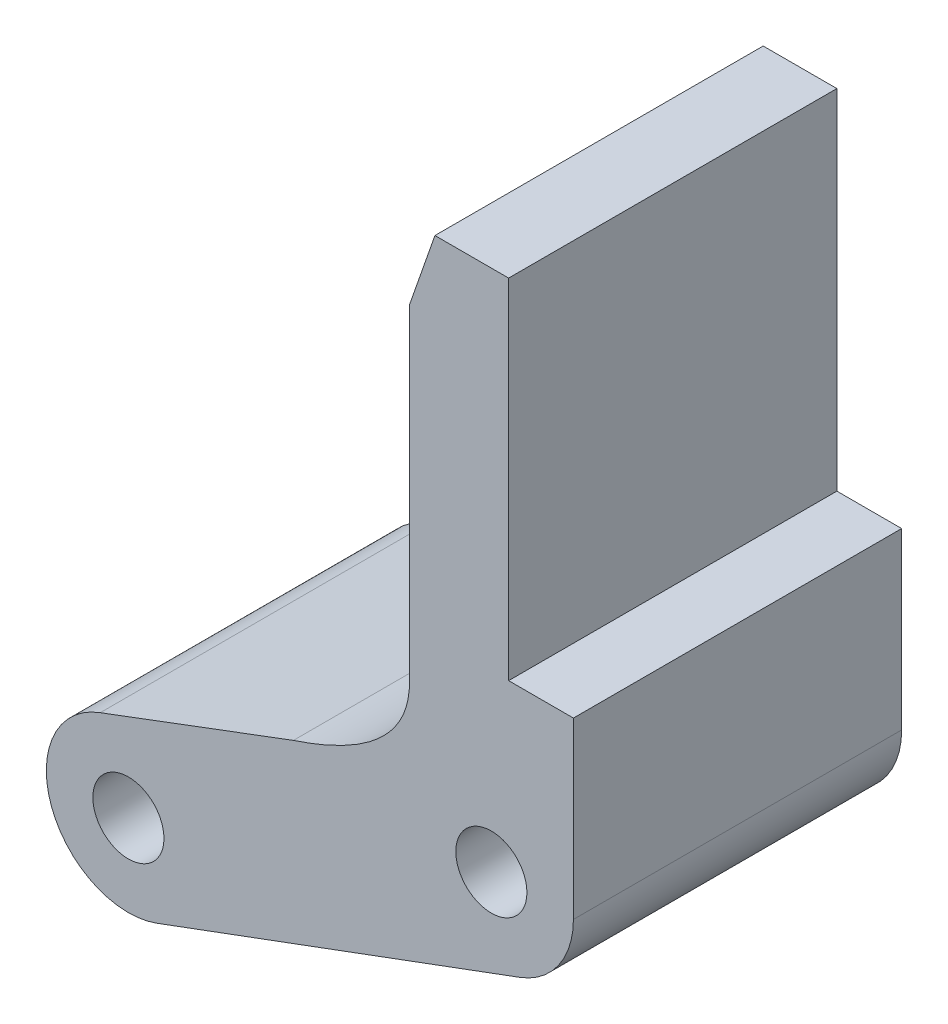
ISO-10303-21;
HEADER;
FILE_DESCRIPTION(('STEP AP214'),'2;1');
FILE_NAME('part.step','',(''),(''),'','','');
FILE_SCHEMA(('AUTOMOTIVE_DESIGN { 1 0 10303 214 1 1 1 1 }'));
ENDSEC;
DATA;
#1=APPLICATION_CONTEXT('core data for automotive mechanical design processes');
#2=APPLICATION_PROTOCOL_DEFINITION('international standard','automotive_design',2000,#1);
#3=PRODUCT_CONTEXT('',#1,'mechanical');
#4=PRODUCT('Part','Part','',(#3));
#5=PRODUCT_RELATED_PRODUCT_CATEGORY('part','',(#4));
#6=PRODUCT_DEFINITION_FORMATION('','',#4);
#7=PRODUCT_DEFINITION_CONTEXT('part definition',#1,'design');
#8=PRODUCT_DEFINITION('design','',#6,#7);
#9=PRODUCT_DEFINITION_SHAPE('','',#8);
#10=(LENGTH_UNIT() NAMED_UNIT(*) SI_UNIT(.MILLI.,.METRE.));
#11=(NAMED_UNIT(*) PLANE_ANGLE_UNIT() SI_UNIT($,.RADIAN.));
#12=(NAMED_UNIT(*) SI_UNIT($,.STERADIAN.) SOLID_ANGLE_UNIT());
#13=UNCERTAINTY_MEASURE_WITH_UNIT(LENGTH_MEASURE(1.E-05),#10,'distance_accuracy_value','');
#14=(GEOMETRIC_REPRESENTATION_CONTEXT(3) GLOBAL_UNCERTAINTY_ASSIGNED_CONTEXT((#13)) GLOBAL_UNIT_ASSIGNED_CONTEXT((#10,
#11,#12)) REPRESENTATION_CONTEXT('',''));
#15=CARTESIAN_POINT('',(0.,0.,0.));
#16=DIRECTION('',(0.,0.,1.));
#17=DIRECTION('',(1.,0.,0.));
#18=AXIS2_PLACEMENT_3D('',#15,#16,#17);
#19=CARTESIAN_POINT('',(158.766015625048,0.,12.));
#20=DIRECTION('',(1.,0.,0.));
#21=DIRECTION('',(0.,0.,-1.));
#22=AXIS2_PLACEMENT_3D('',#19,#20,#21);
#23=PLANE('',#22);
#24=DIRECTION('',(0.,-1.,0.));
#25=VECTOR('',#24,1.);
#26=CARTESIAN_POINT('',(158.766015625048,0.,0.));
#27=LINE('',#26,#25);
#28=CARTESIAN_POINT('',(158.766015625048,185.623295295876,0.));
#29=VERTEX_POINT('',#28);
#30=CARTESIAN_POINT('',(158.766015625048,173.8391741651,0.));
#31=VERTEX_POINT('',#30);
#32=EDGE_CURVE('E158',#29,#31,#27,.T.);
#33=ORIENTED_EDGE('',*,*,#32,.T.);
#34=DIRECTION('',(0.,0.,-1.));
#35=VECTOR('',#34,1.);
#36=CARTESIAN_POINT('',(158.766015625048,173.8391741651,12.));
#37=LINE('',#36,#35);
#38=CARTESIAN_POINT('',(158.766015625048,173.8391741651,12.));
#39=VERTEX_POINT('',#38);
#40=EDGE_CURVE('E11',#39,#31,#37,.T.);
#41=ORIENTED_EDGE('',*,*,#40,.F.);
#42=DIRECTION('',(0.,-1.,0.));
#43=VECTOR('',#42,1.);
#44=CARTESIAN_POINT('',(158.766015625048,0.,12.));
#45=LINE('',#44,#43);
#46=CARTESIAN_POINT('',(158.766015625048,185.623295295876,12.));
#47=VERTEX_POINT('',#46);
#48=EDGE_CURVE('E289',#47,#39,#45,.T.);
#49=ORIENTED_EDGE('',*,*,#48,.F.);
#50=DIRECTION('',(0.,0.,-1.));
#51=VECTOR('',#50,1.);
#52=CARTESIAN_POINT('',(158.766015625048,185.623295295876,12.));
#53=LINE('',#52,#51);
#54=EDGE_CURVE('E52',#47,#29,#53,.T.);
#55=ORIENTED_EDGE('',*,*,#54,.T.);
#56=EDGE_LOOP('',(#33,#41,#49,#55));
#57=FACE_BOUND('',#56,.T.);
#58=ADVANCED_FACE('F35',(#57),#23,.F.);
#59=CARTESIAN_POINT('',(158.766015625048,173.8391741651,12.));
#60=CARTESIAN_POINT('',(158.90801150286,171.162488290367,12.));
#61=CARTESIAN_POINT('',(154.528686770883,169.726069000254,12.));
#62=B_SPLINE_CURVE_WITH_KNOTS('',2,(#59,#60,#61),.UNSPECIFIED.,.F.,.F.,(3,3),(0.,1.),.UNSPECIFIED.);
#63=DIRECTION('',(0.,0.,-1.));
#64=VECTOR('',#63,1.);
#65=SURFACE_OF_LINEAR_EXTRUSION('',#62,#64);
#66=CARTESIAN_POINT('',(158.766015625048,173.8391741651,0.));
#67=CARTESIAN_POINT('',(158.90801150286,171.162488290367,0.));
#68=CARTESIAN_POINT('',(154.528686770883,169.726069000254,0.));
#69=B_SPLINE_CURVE_WITH_KNOTS('',2,(#66,#67,#68),.UNSPECIFIED.,.F.,.F.,(3,3),(0.,1.),.UNSPECIFIED.);
#70=CARTESIAN_POINT('',(154.528686770883,169.726069000254,0.));
#71=VERTEX_POINT('',#70);
#72=EDGE_CURVE('E160',#31,#71,#69,.T.);
#73=ORIENTED_EDGE('',*,*,#72,.T.);
#74=DIRECTION('',(0.,0.,-1.));
#75=VECTOR('',#74,1.);
#76=CARTESIAN_POINT('',(154.528686770883,169.726069000254,12.));
#77=LINE('',#76,#75);
#78=CARTESIAN_POINT('',(154.528686770883,169.726069000254,12.));
#79=VERTEX_POINT('',#78);
#80=EDGE_CURVE('E44',#79,#71,#77,.T.);
#81=ORIENTED_EDGE('',*,*,#80,.F.);
#82=EDGE_CURVE('E99',#39,#79,#62,.T.);
#83=ORIENTED_EDGE('',*,*,#82,.F.);
#84=ORIENTED_EDGE('',*,*,#40,.T.);
#85=EDGE_LOOP('',(#73,#81,#83,#84));
#86=FACE_BOUND('',#85,.T.);
#87=ADVANCED_FACE('F210',(#86),#65,.F.);
#88=CARTESIAN_POINT('',(-36.7675196725926,97.8340634056107,12.));
#89=DIRECTION('',(-0.35179229240198,0.936078085955739,0.));
#90=DIRECTION('',(-0.936078085955739,-0.35179229240198,0.));
#91=AXIS2_PLACEMENT_3D('',#88,#89,#90);
#92=PLANE('',#91);
#93=DIRECTION('',(0.936078085955739,0.35179229240198,0.));
#94=VECTOR('',#93,1.);
#95=CARTESIAN_POINT('',(-36.7675196725926,97.8340634056107,0.));
#96=LINE('',#95,#94);
#97=CARTESIAN_POINT('',(147.466091463263,167.071838940976,0.));
#98=VERTEX_POINT('',#97);
#99=EDGE_CURVE('E165',#98,#71,#96,.T.);
#100=ORIENTED_EDGE('',*,*,#99,.F.);
#101=DIRECTION('',(0.,0.,-1.));
#102=VECTOR('',#101,1.);
#103=CARTESIAN_POINT('',(147.466091463263,167.071838940976,12.));
#104=LINE('',#103,#102);
#105=CARTESIAN_POINT('',(147.466091463263,167.071838940976,12.));
#106=VERTEX_POINT('',#105);
#107=EDGE_CURVE('E203',#106,#98,#104,.T.);
#108=ORIENTED_EDGE('',*,*,#107,.F.);
#109=DIRECTION('',(0.936078085955739,0.35179229240198,0.));
#110=VECTOR('',#109,1.);
#111=CARTESIAN_POINT('',(-36.7675196725926,97.8340634056107,12.));
#112=LINE('',#111,#110);
#113=EDGE_CURVE('E209',#106,#79,#112,.T.);
#114=ORIENTED_EDGE('',*,*,#113,.T.);
#115=ORIENTED_EDGE('',*,*,#80,.T.);
#116=EDGE_LOOP('',(#100,#108,#114,#115));
#117=FACE_BOUND('',#116,.T.);
#118=ADVANCED_FACE('F207',(#117),#92,.T.);
#119=CARTESIAN_POINT('',(148.495180794413,164.253865351938,12.));
#120=DIRECTION('',(0.,0.,-1.));
#121=DIRECTION('',(-1.,0.,0.));
#122=AXIS2_PLACEMENT_3D('',#119,#120,#121);
#123=CYLINDRICAL_SURFACE('',#122,3.);
#124=CARTESIAN_POINT('',(148.495180794413,164.253865351938,0.));
#125=DIRECTION('',(0.,0.,1.));
#126=DIRECTION('',(1.,0.,0.));
#127=AXIS2_PLACEMENT_3D('',#124,#125,#126);
#128=CIRCLE('',#127,3.);
#129=CARTESIAN_POINT('',(149.524270125563,161.435891762901,0.));
#130=VERTEX_POINT('',#129);
#131=EDGE_CURVE('E171',#98,#130,#128,.T.);
#132=ORIENTED_EDGE('',*,*,#131,.T.);
#133=DIRECTION('',(0.,0.,-1.));
#134=VECTOR('',#133,1.);
#135=CARTESIAN_POINT('',(149.524270125563,161.435891762901,12.));
#136=LINE('',#135,#134);
#137=CARTESIAN_POINT('',(149.524270125563,161.435891762901,12.));
#138=VERTEX_POINT('',#137);
#139=EDGE_CURVE('E200',#138,#130,#136,.T.);
#140=ORIENTED_EDGE('',*,*,#139,.F.);
#141=CARTESIAN_POINT('',(148.495180794413,164.253865351938,12.));
#142=DIRECTION('',(0.,0.,1.));
#143=DIRECTION('',(1.,0.,0.));
#144=AXIS2_PLACEMENT_3D('',#141,#142,#143);
#145=CIRCLE('',#144,3.);
#146=EDGE_CURVE('E228',#106,#138,#145,.T.);
#147=ORIENTED_EDGE('',*,*,#146,.F.);
#148=ORIENTED_EDGE('',*,*,#107,.T.);
#149=EDGE_LOOP('',(#132,#140,#147,#148));
#150=FACE_BOUND('',#149,.T.);
#151=ADVANCED_FACE('F219',(#150),#123,.T.);
#152=CARTESIAN_POINT('',(-34.5523500097476,93.1721411502797,12.));
#153=DIRECTION('',(-0.347705016293584,0.937603979110732,0.));
#154=DIRECTION('',(-0.937603979110732,-0.347705016293584,0.));
#155=AXIS2_PLACEMENT_3D('',#152,#153,#154);
#156=PLANE('',#155);
#157=DIRECTION('',(0.937603979110732,0.347705016293584,0.));
#158=VECTOR('',#157,1.);
#159=CARTESIAN_POINT('',(-34.5523500097476,93.1721411502797,0.));
#160=LINE('',#159,#158);
#161=CARTESIAN_POINT('',(162.7934189295,166.356678901038,0.));
#162=VERTEX_POINT('',#161);
#163=EDGE_CURVE('E173',#130,#162,#160,.T.);
#164=ORIENTED_EDGE('',*,*,#163,.T.);
#165=DIRECTION('',(0.,0.,-1.));
#166=VECTOR('',#165,1.);
#167=CARTESIAN_POINT('',(162.7934189295,166.356678901038,12.));
#168=LINE('',#167,#166);
#169=CARTESIAN_POINT('',(162.7934189295,166.356678901038,12.));
#170=VERTEX_POINT('',#169);
#171=EDGE_CURVE('E197',#170,#162,#168,.T.);
#172=ORIENTED_EDGE('',*,*,#171,.F.);
#173=DIRECTION('',(0.937603979110732,0.347705016293584,0.));
#174=VECTOR('',#173,1.);
#175=CARTESIAN_POINT('',(-34.5523500097476,93.1721411502797,12.));
#176=LINE('',#175,#174);
#177=EDGE_CURVE('E225',#138,#170,#176,.T.);
#178=ORIENTED_EDGE('',*,*,#177,.F.);
#179=ORIENTED_EDGE('',*,*,#139,.T.);
#180=EDGE_LOOP('',(#164,#172,#178,#179));
#181=FACE_BOUND('',#180,.T.);
#182=ADVANCED_FACE('F223',(#181),#156,.F.);
#183=CARTESIAN_POINT('',(161.764329598349,169.174652490076,12.));
#184=DIRECTION('',(0.,0.,-1.));
#185=DIRECTION('',(-1.,0.,0.));
#186=AXIS2_PLACEMENT_3D('',#183,#184,#185);
#187=CYLINDRICAL_SURFACE('',#186,3.);
#188=CARTESIAN_POINT('',(161.764329598349,169.174652490076,0.));
#189=DIRECTION('',(0.,0.,1.));
#190=DIRECTION('',(1.,0.,0.));
#191=AXIS2_PLACEMENT_3D('',#188,#189,#190);
#192=CIRCLE('',#191,3.);
#193=CARTESIAN_POINT('',(164.764329598349,169.174652490076,0.));
#194=VERTEX_POINT('',#193);
#195=EDGE_CURVE('E175',#162,#194,#192,.T.);
#196=ORIENTED_EDGE('',*,*,#195,.T.);
#197=DIRECTION('',(0.,0.,-1.));
#198=VECTOR('',#197,1.);
#199=CARTESIAN_POINT('',(164.764329598349,169.174652490076,12.));
#200=LINE('',#199,#198);
#201=CARTESIAN_POINT('',(164.764329598349,169.174652490076,12.));
#202=VERTEX_POINT('',#201);
#203=EDGE_CURVE('E195',#202,#194,#200,.T.);
#204=ORIENTED_EDGE('',*,*,#203,.F.);
#205=CARTESIAN_POINT('',(161.764329598349,169.174652490076,12.));
#206=DIRECTION('',(0.,0.,1.));
#207=DIRECTION('',(1.,0.,0.));
#208=AXIS2_PLACEMENT_3D('',#205,#206,#207);
#209=CIRCLE('',#208,3.);
#210=EDGE_CURVE('E227',#170,#202,#209,.T.);
#211=ORIENTED_EDGE('',*,*,#210,.F.);
#212=ORIENTED_EDGE('',*,*,#171,.T.);
#213=EDGE_LOOP('',(#196,#204,#211,#212));
#214=FACE_BOUND('',#213,.T.);
#215=ADVANCED_FACE('F241',(#214),#187,.T.);
#216=CARTESIAN_POINT('',(164.764329598349,0.,12.));
#217=DIRECTION('',(1.,0.,0.));
#218=DIRECTION('',(0.,0.,-1.));
#219=AXIS2_PLACEMENT_3D('',#216,#217,#218);
#220=PLANE('',#219);
#221=DIRECTION('',(0.,-1.,0.));
#222=VECTOR('',#221,1.);
#223=CARTESIAN_POINT('',(164.764329598349,0.,0.));
#224=LINE('',#223,#222);
#225=CARTESIAN_POINT('',(164.764329598349,175.550568137609,0.));
#226=VERTEX_POINT('',#225);
#227=EDGE_CURVE('E178',#226,#194,#224,.T.);
#228=ORIENTED_EDGE('',*,*,#227,.F.);
#229=DIRECTION('',(0.,0.,-1.));
#230=VECTOR('',#229,1.);
#231=CARTESIAN_POINT('',(164.764329598349,175.550568137609,12.));
#232=LINE('',#231,#230);
#233=CARTESIAN_POINT('',(164.764329598349,175.550568137609,12.));
#234=VERTEX_POINT('',#233);
#235=EDGE_CURVE('E193',#234,#226,#232,.T.);
#236=ORIENTED_EDGE('',*,*,#235,.F.);
#237=DIRECTION('',(0.,-1.,0.));
#238=VECTOR('',#237,1.);
#239=CARTESIAN_POINT('',(164.764329598349,0.,12.));
#240=LINE('',#239,#238);
#241=EDGE_CURVE('E230',#234,#202,#240,.T.);
#242=ORIENTED_EDGE('',*,*,#241,.T.);
#243=ORIENTED_EDGE('',*,*,#203,.T.);
#244=EDGE_LOOP('',(#228,#236,#242,#243));
#245=FACE_BOUND('',#244,.T.);
#246=ADVANCED_FACE('F238',(#245),#220,.T.);
#247=CARTESIAN_POINT('',(0.,175.550568137609,12.));
#248=DIRECTION('',(0.,-1.,0.));
#249=DIRECTION('',(0.,0.,-1.));
#250=AXIS2_PLACEMENT_3D('',#247,#248,#249);
#251=PLANE('',#250);
#252=DIRECTION('',(-1.,0.,0.));
#253=VECTOR('',#252,1.);
#254=CARTESIAN_POINT('',(0.,175.550568137609,0.));
#255=LINE('',#254,#253);
#256=CARTESIAN_POINT('',(162.395959169515,175.550568137609,0.));
#257=VERTEX_POINT('',#256);
#258=EDGE_CURVE('E181',#226,#257,#255,.T.);
#259=ORIENTED_EDGE('',*,*,#258,.T.);
#260=DIRECTION('',(0.,0.,-1.));
#261=VECTOR('',#260,1.);
#262=CARTESIAN_POINT('',(162.395959169515,175.550568137609,12.));
#263=LINE('',#262,#261);
#264=CARTESIAN_POINT('',(162.395959169515,175.550568137609,12.));
#265=VERTEX_POINT('',#264);
#266=EDGE_CURVE('E144',#265,#257,#263,.T.);
#267=ORIENTED_EDGE('',*,*,#266,.F.);
#268=DIRECTION('',(-1.,0.,0.));
#269=VECTOR('',#268,1.);
#270=CARTESIAN_POINT('',(0.,175.550568137609,12.));
#271=LINE('',#270,#269);
#272=EDGE_CURVE('E132',#234,#265,#271,.T.);
#273=ORIENTED_EDGE('',*,*,#272,.F.);
#274=ORIENTED_EDGE('',*,*,#235,.T.);
#275=EDGE_LOOP('',(#259,#267,#273,#274));
#276=FACE_BOUND('',#275,.T.);
#277=ADVANCED_FACE('F244',(#276),#251,.F.);
#278=CARTESIAN_POINT('',(162.395959169515,0.,12.));
#279=DIRECTION('',(-1.,0.,0.));
#280=DIRECTION('',(0.,0.,1.));
#281=AXIS2_PLACEMENT_3D('',#278,#279,#280);
#282=PLANE('',#281);
#283=DIRECTION('',(0.,1.,0.));
#284=VECTOR('',#283,1.);
#285=CARTESIAN_POINT('',(162.395959169515,0.,0.));
#286=LINE('',#285,#284);
#287=CARTESIAN_POINT('',(162.395959169515,188.296706066005,0.));
#288=VERTEX_POINT('',#287);
#289=EDGE_CURVE('E141',#257,#288,#286,.T.);
#290=ORIENTED_EDGE('',*,*,#289,.T.);
#291=DIRECTION('',(0.,0.,-1.));
#292=VECTOR('',#291,1.);
#293=CARTESIAN_POINT('',(162.395959169515,188.296706066005,12.));
#294=LINE('',#293,#292);
#295=CARTESIAN_POINT('',(162.395959169515,188.296706066005,12.));
#296=VERTEX_POINT('',#295);
#297=EDGE_CURVE('E138',#296,#288,#294,.T.);
#298=ORIENTED_EDGE('',*,*,#297,.F.);
#299=DIRECTION('',(0.,1.,0.));
#300=VECTOR('',#299,1.);
#301=CARTESIAN_POINT('',(162.395959169515,0.,12.));
#302=LINE('',#301,#300);
#303=EDGE_CURVE('E124',#265,#296,#302,.T.);
#304=ORIENTED_EDGE('',*,*,#303,.F.);
#305=ORIENTED_EDGE('',*,*,#266,.T.);
#306=EDGE_LOOP('',(#290,#298,#304,#305));
#307=FACE_BOUND('',#306,.T.);
#308=ADVANCED_FACE('F139',(#307),#282,.F.);
#309=CARTESIAN_POINT('',(0.,188.296706066005,12.));
#310=DIRECTION('',(0.,1.,0.));
#311=DIRECTION('',(0.,0.,1.));
#312=AXIS2_PLACEMENT_3D('',#309,#310,#311);
#313=PLANE('',#312);
#314=DIRECTION('',(1.,0.,0.));
#315=VECTOR('',#314,1.);
#316=CARTESIAN_POINT('',(0.,188.296706066005,0.));
#317=LINE('',#316,#315);
#318=CARTESIAN_POINT('',(159.701668195027,188.296706066005,0.));
#319=VERTEX_POINT('',#318);
#320=EDGE_CURVE('E184',#319,#288,#317,.T.);
#321=ORIENTED_EDGE('',*,*,#320,.F.);
#322=DIRECTION('',(0.,0.,-1.));
#323=VECTOR('',#322,1.);
#324=CARTESIAN_POINT('',(159.701668195027,188.296706066005,12.));
#325=LINE('',#324,#323);
#326=CARTESIAN_POINT('',(159.701668195027,188.296706066005,12.));
#327=VERTEX_POINT('',#326);
#328=EDGE_CURVE('E87',#327,#319,#325,.T.);
#329=ORIENTED_EDGE('',*,*,#328,.F.);
#330=DIRECTION('',(1.,0.,0.));
#331=VECTOR('',#330,1.);
#332=CARTESIAN_POINT('',(0.,188.296706066005,12.));
#333=LINE('',#332,#331);
#334=EDGE_CURVE('E129',#327,#296,#333,.T.);
#335=ORIENTED_EDGE('',*,*,#334,.T.);
#336=ORIENTED_EDGE('',*,*,#297,.T.);
#337=EDGE_LOOP('',(#321,#329,#335,#336));
#338=FACE_BOUND('',#337,.T.);
#339=ADVANCED_FACE('F146',(#338),#313,.T.);
#340=CARTESIAN_POINT('',(161.764329598349,169.174652490076,12.));
#341=DIRECTION('',(0.,0.,-1.));
#342=DIRECTION('',(-1.,0.,0.));
#343=AXIS2_PLACEMENT_3D('',#340,#341,#342);
#344=CYLINDRICAL_SURFACE('',#343,1.30000000000001);
#345=CARTESIAN_POINT('',(161.764329598349,169.174652490076,12.));
#346=DIRECTION('',(0.,0.,1.));
#347=DIRECTION('',(1.,0.,0.));
#348=AXIS2_PLACEMENT_3D('',#345,#346,#347);
#349=CIRCLE('',#348,1.30000000000001);
#350=CARTESIAN_POINT('',(163.064329598349,169.174652490076,12.));
#351=VERTEX_POINT('',#350);
#352=EDGE_CURVE('E274',#351,#351,#349,.T.);
#353=ORIENTED_EDGE('',*,*,#352,.T.);
#354=EDGE_LOOP('',(#353));
#355=FACE_BOUND('',#354,.T.);
#356=CARTESIAN_POINT('',(161.764329598349,169.174652490076,0.));
#357=DIRECTION('',(0.,0.,1.));
#358=DIRECTION('',(1.,0.,0.));
#359=AXIS2_PLACEMENT_3D('',#356,#357,#358);
#360=CIRCLE('',#359,1.30000000000001);
#361=CARTESIAN_POINT('',(163.064329598349,169.174652490076,0.));
#362=VERTEX_POINT('',#361);
#363=EDGE_CURVE('E155',#362,#362,#360,.T.);
#364=ORIENTED_EDGE('',*,*,#363,.F.);
#365=EDGE_LOOP('',(#364));
#366=FACE_BOUND('',#365,.T.);
#367=ADVANCED_FACE('F261',(#355,#366),#344,.F.);
#368=CARTESIAN_POINT('',(148.495180794413,164.253865351938,12.));
#369=DIRECTION('',(0.,0.,-1.));
#370=DIRECTION('',(-1.,0.,0.));
#371=AXIS2_PLACEMENT_3D('',#368,#369,#370);
#372=CYLINDRICAL_SURFACE('',#371,1.30000000000001);
#373=CARTESIAN_POINT('',(148.495180794413,164.253865351938,12.));
#374=DIRECTION('',(0.,0.,1.));
#375=DIRECTION('',(1.,0.,0.));
#376=AXIS2_PLACEMENT_3D('',#373,#374,#375);
#377=CIRCLE('',#376,1.30000000000001);
#378=CARTESIAN_POINT('',(149.795180794413,164.253865351938,12.));
#379=VERTEX_POINT('',#378);
#380=EDGE_CURVE('E189',#379,#379,#377,.T.);
#381=ORIENTED_EDGE('',*,*,#380,.T.);
#382=EDGE_LOOP('',(#381));
#383=FACE_BOUND('',#382,.T.);
#384=CARTESIAN_POINT('',(148.495180794413,164.253865351938,0.));
#385=DIRECTION('',(0.,0.,1.));
#386=DIRECTION('',(1.,0.,0.));
#387=AXIS2_PLACEMENT_3D('',#384,#385,#386);
#388=CIRCLE('',#387,1.30000000000001);
#389=CARTESIAN_POINT('',(149.795180794413,164.253865351938,0.));
#390=VERTEX_POINT('',#389);
#391=EDGE_CURVE('E152',#390,#390,#388,.T.);
#392=ORIENTED_EDGE('',*,*,#391,.F.);
#393=EDGE_LOOP('',(#392));
#394=FACE_BOUND('',#393,.T.);
#395=ADVANCED_FACE('F37',(#383,#394),#372,.F.);
#396=CARTESIAN_POINT('',(83.5649214539368,-29.2464347013435,12.));
#397=DIRECTION('',(-0.943862891697567,0.330337466352679,0.));
#398=DIRECTION('',(-0.330337466352679,-0.943862891697567,0.));
#399=AXIS2_PLACEMENT_3D('',#396,#397,#398);
#400=PLANE('',#399);
#401=DIRECTION('',(0.330337466352679,0.943862891697567,0.));
#402=VECTOR('',#401,1.);
#403=CARTESIAN_POINT('',(83.5649214539368,-29.2464347013435,0.));
#404=LINE('',#403,#402);
#405=EDGE_CURVE('E186',#29,#319,#404,.T.);
#406=ORIENTED_EDGE('',*,*,#405,.F.);
#407=ORIENTED_EDGE('',*,*,#54,.F.);
#408=DIRECTION('',(0.330337466352679,0.943862891697567,0.));
#409=VECTOR('',#408,1.);
#410=CARTESIAN_POINT('',(83.5649214539368,-29.2464347013435,12.));
#411=LINE('',#410,#409);
#412=EDGE_CURVE('E147',#47,#327,#411,.T.);
#413=ORIENTED_EDGE('',*,*,#412,.T.);
#414=ORIENTED_EDGE('',*,*,#328,.T.);
#415=EDGE_LOOP('',(#406,#407,#413,#414));
#416=FACE_BOUND('',#415,.T.);
#417=ADVANCED_FACE('F268',(#416),#400,.T.);
#418=CARTESIAN_POINT('',(0.,0.,12.));
#419=DIRECTION('',(0.,0.,1.));
#420=DIRECTION('',(1.,0.,0.));
#421=AXIS2_PLACEMENT_3D('',#418,#419,#420);
#422=PLANE('',#421);
#423=ORIENTED_EDGE('',*,*,#380,.F.);
#424=EDGE_LOOP('',(#423));
#425=FACE_BOUND('',#424,.T.);
#426=ORIENTED_EDGE('',*,*,#352,.F.);
#427=EDGE_LOOP('',(#426));
#428=FACE_BOUND('',#427,.T.);
#429=ORIENTED_EDGE('',*,*,#48,.T.);
#430=ORIENTED_EDGE('',*,*,#82,.T.);
#431=ORIENTED_EDGE('',*,*,#113,.F.);
#432=ORIENTED_EDGE('',*,*,#146,.T.);
#433=ORIENTED_EDGE('',*,*,#177,.T.);
#434=ORIENTED_EDGE('',*,*,#210,.T.);
#435=ORIENTED_EDGE('',*,*,#241,.F.);
#436=ORIENTED_EDGE('',*,*,#272,.T.);
#437=ORIENTED_EDGE('',*,*,#303,.T.);
#438=ORIENTED_EDGE('',*,*,#334,.F.);
#439=ORIENTED_EDGE('',*,*,#412,.F.);
#440=EDGE_LOOP('',(#429,#430,#431,#432,#433,#434,#435,#436,#437,#438,#439));
#441=FACE_BOUND('',#440,.T.);
#442=ADVANCED_FACE('F126',(#425,#428,#441),#422,.T.);
#443=CARTESIAN_POINT('',(0.,0.,0.));
#444=DIRECTION('',(0.,0.,1.));
#445=DIRECTION('',(1.,0.,0.));
#446=AXIS2_PLACEMENT_3D('',#443,#444,#445);
#447=PLANE('',#446);
#448=ORIENTED_EDGE('',*,*,#391,.T.);
#449=EDGE_LOOP('',(#448));
#450=FACE_BOUND('',#449,.T.);
#451=ORIENTED_EDGE('',*,*,#363,.T.);
#452=EDGE_LOOP('',(#451));
#453=FACE_BOUND('',#452,.T.);
#454=ORIENTED_EDGE('',*,*,#32,.F.);
#455=ORIENTED_EDGE('',*,*,#405,.T.);
#456=ORIENTED_EDGE('',*,*,#320,.T.);
#457=ORIENTED_EDGE('',*,*,#289,.F.);
#458=ORIENTED_EDGE('',*,*,#258,.F.);
#459=ORIENTED_EDGE('',*,*,#227,.T.);
#460=ORIENTED_EDGE('',*,*,#195,.F.);
#461=ORIENTED_EDGE('',*,*,#163,.F.);
#462=ORIENTED_EDGE('',*,*,#131,.F.);
#463=ORIENTED_EDGE('',*,*,#99,.T.);
#464=ORIENTED_EDGE('',*,*,#72,.F.);
#465=EDGE_LOOP('',(#454,#455,#456,#457,#458,#459,#460,#461,#462,#463,#464));
#466=FACE_BOUND('',#465,.T.);
#467=ADVANCED_FACE('F214',(#450,#453,#466),#447,.F.);
#468=CLOSED_SHELL('',(#58,#87,#118,#151,#182,#215,#246,#277,#308,#339,#367,#395,#417,#442,#467));
#469=MANIFOLD_SOLID_BREP('B2',#468);
#470=ADVANCED_BREP_SHAPE_REPRESENTATION('',(#18,#469),#14);
#471=SHAPE_DEFINITION_REPRESENTATION(#9,#470);
ENDSEC;
END-ISO-10303-21;
